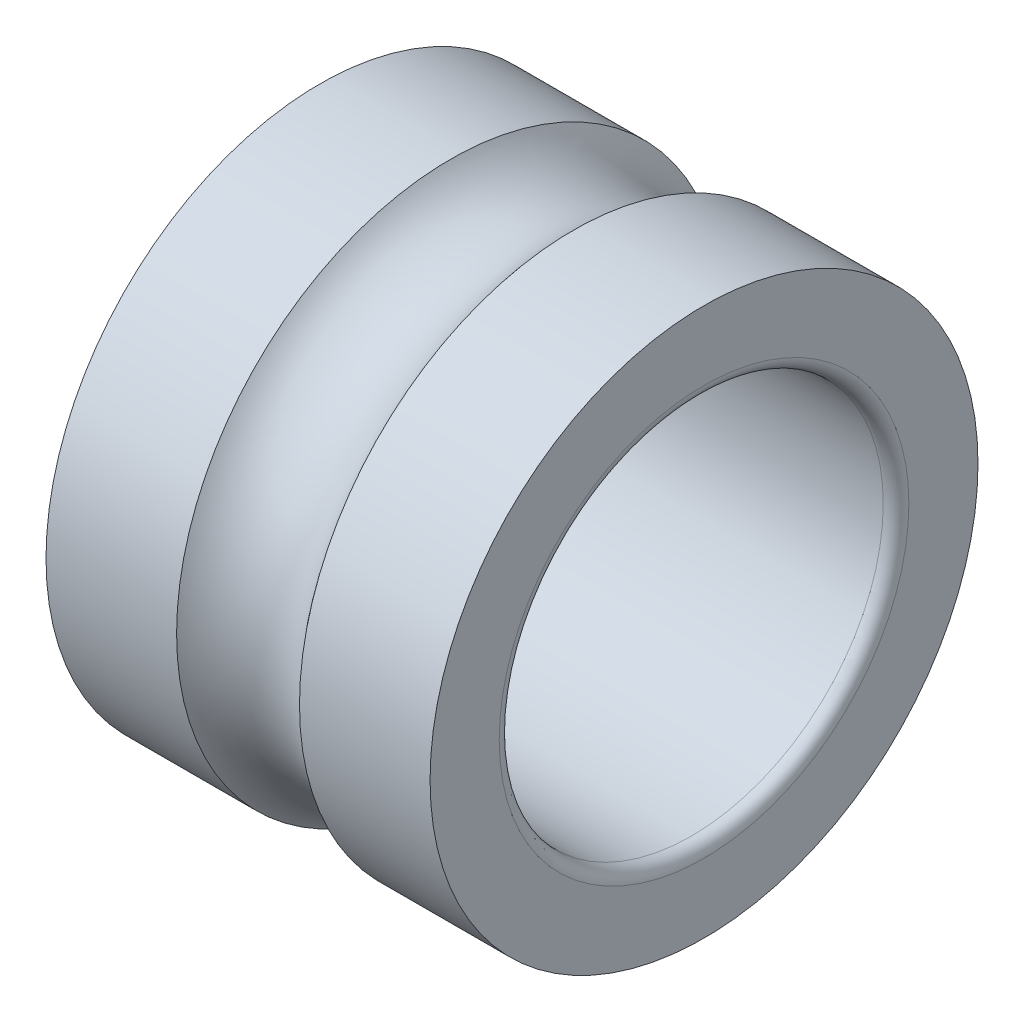
ISO-10303-21;
HEADER;
FILE_DESCRIPTION(('STEP AP214'),'2;1');
FILE_NAME('part.step','',(''),(''),'','','');
FILE_SCHEMA(('AUTOMOTIVE_DESIGN { 1 0 10303 214 1 1 1 1 }'));
ENDSEC;
DATA;
#1=APPLICATION_CONTEXT('core data for automotive mechanical design processes');
#2=APPLICATION_PROTOCOL_DEFINITION('international standard','automotive_design',2000,#1);
#3=PRODUCT_CONTEXT('',#1,'mechanical');
#4=PRODUCT('Part','Part','',(#3));
#5=PRODUCT_RELATED_PRODUCT_CATEGORY('part','',(#4));
#6=PRODUCT_DEFINITION_FORMATION('','',#4);
#7=PRODUCT_DEFINITION_CONTEXT('part definition',#1,'design');
#8=PRODUCT_DEFINITION('design','',#6,#7);
#9=PRODUCT_DEFINITION_SHAPE('','',#8);
#10=(LENGTH_UNIT() NAMED_UNIT(*) SI_UNIT(.MILLI.,.METRE.));
#11=(NAMED_UNIT(*) PLANE_ANGLE_UNIT() SI_UNIT($,.RADIAN.));
#12=(NAMED_UNIT(*) SI_UNIT($,.STERADIAN.) SOLID_ANGLE_UNIT());
#13=UNCERTAINTY_MEASURE_WITH_UNIT(LENGTH_MEASURE(1.E-05),#10,'distance_accuracy_value','');
#14=(GEOMETRIC_REPRESENTATION_CONTEXT(3) GLOBAL_UNCERTAINTY_ASSIGNED_CONTEXT((#13)) GLOBAL_UNIT_ASSIGNED_CONTEXT((#10,
#11,#12)) REPRESENTATION_CONTEXT('',''));
#15=CARTESIAN_POINT('',(0.,0.,0.));
#16=DIRECTION('',(0.,0.,1.));
#17=DIRECTION('',(1.,0.,0.));
#18=AXIS2_PLACEMENT_3D('',#15,#16,#17);
#19=CARTESIAN_POINT('',(-0.5,0.,0.));
#20=DIRECTION('',(1.,0.,0.));
#21=DIRECTION('',(0.,0.,-1.));
#22=AXIS2_PLACEMENT_3D('',#19,#20,#21);
#23=CYLINDRICAL_SURFACE('',#22,2.14);
#24=CARTESIAN_POINT('',(-0.5,0.,0.));
#25=DIRECTION('',(-1.,0.,0.));
#26=DIRECTION('',(0.,0.,1.));
#27=AXIS2_PLACEMENT_3D('',#24,#25,#26);
#28=CIRCLE('',#27,2.14);
#29=CARTESIAN_POINT('',(-0.5,0.,2.14));
#30=VERTEX_POINT('',#29);
#31=CARTESIAN_POINT('',(-0.5,0.,-2.14));
#32=VERTEX_POINT('',#31);
#33=EDGE_CURVE('E85',#30,#32,#28,.T.);
#34=ORIENTED_EDGE('',*,*,#33,.F.);
#35=CARTESIAN_POINT('',(-0.5,0.,0.));
#36=DIRECTION('',(-1.,0.,0.));
#37=DIRECTION('',(0.,0.,-1.));
#38=AXIS2_PLACEMENT_3D('',#35,#36,#37);
#39=CIRCLE('',#38,2.14);
#40=EDGE_CURVE('E75',#32,#30,#39,.T.);
#41=ORIENTED_EDGE('',*,*,#40,.F.);
#42=DIRECTION('',(1.,0.,0.));
#43=VECTOR('',#42,1.);
#44=CARTESIAN_POINT('',(0.00999999999999997,0.,-2.14));
#45=LINE('',#44,#43);
#46=CARTESIAN_POINT('',(0.52,0.,-2.14));
#47=VERTEX_POINT('',#46);
#48=EDGE_CURVE('E11',#32,#47,#45,.T.);
#49=ORIENTED_EDGE('',*,*,#48,.T.);
#50=CARTESIAN_POINT('',(0.52,0.,0.));
#51=DIRECTION('',(-1.,0.,0.));
#52=DIRECTION('',(0.,0.,-1.));
#53=AXIS2_PLACEMENT_3D('',#50,#51,#52);
#54=CIRCLE('',#53,2.14);
#55=CARTESIAN_POINT('',(0.52,0.,2.14));
#56=VERTEX_POINT('',#55);
#57=EDGE_CURVE('E27',#47,#56,#54,.T.);
#58=ORIENTED_EDGE('',*,*,#57,.T.);
#59=CARTESIAN_POINT('',(0.52,0.,0.));
#60=DIRECTION('',(-1.,0.,0.));
#61=DIRECTION('',(0.,0.,1.));
#62=AXIS2_PLACEMENT_3D('',#59,#60,#61);
#63=CIRCLE('',#62,2.14);
#64=EDGE_CURVE('E145',#56,#47,#63,.T.);
#65=ORIENTED_EDGE('',*,*,#64,.T.);
#66=ORIENTED_EDGE('',*,*,#48,.F.);
#67=EDGE_LOOP('',(#34,#41,#49,#58,#65,#66));
#68=FACE_BOUND('',#67,.T.);
#69=ADVANCED_FACE('F16',(#68),#23,.T.);
#70=CARTESIAN_POINT('',(0.999999999999995,0.,0.));
#71=DIRECTION('',(-1.,0.,0.));
#72=DIRECTION('',(0.,0.,1.));
#73=AXIS2_PLACEMENT_3D('',#70,#71,#72);
#74=TOROIDAL_SURFACE('',#73,2.49999999999999,0.599999999999992);
#75=CARTESIAN_POINT('',(1.48,0.,0.));
#76=DIRECTION('',(-1.,0.,0.));
#77=DIRECTION('',(0.,0.,1.));
#78=AXIS2_PLACEMENT_3D('',#75,#76,#77);
#79=CIRCLE('',#78,2.14);
#80=CARTESIAN_POINT('',(1.48,0.,2.14));
#81=VERTEX_POINT('',#80);
#82=CARTESIAN_POINT('',(1.48,0.,-2.14));
#83=VERTEX_POINT('',#82);
#84=EDGE_CURVE('E170',#81,#83,#79,.T.);
#85=ORIENTED_EDGE('',*,*,#84,.T.);
#86=CARTESIAN_POINT('',(0.999999999999999,0.,-2.5));
#87=DIRECTION('',(0.,-1.,0.));
#88=DIRECTION('',(0.8,0.,0.6));
#89=AXIS2_PLACEMENT_3D('',#86,#87,#88);
#90=CIRCLE('',#89,0.600000000000001);
#91=EDGE_CURVE('E151',#83,#47,#90,.T.);
#92=ORIENTED_EDGE('',*,*,#91,.T.);
#93=ORIENTED_EDGE('',*,*,#64,.F.);
#94=ORIENTED_EDGE('',*,*,#57,.F.);
#95=ORIENTED_EDGE('',*,*,#91,.F.);
#96=CARTESIAN_POINT('',(1.48,0.,0.));
#97=DIRECTION('',(-1.,0.,0.));
#98=DIRECTION('',(0.,0.,-1.));
#99=AXIS2_PLACEMENT_3D('',#96,#97,#98);
#100=CIRCLE('',#99,2.14);
#101=EDGE_CURVE('E167',#83,#81,#100,.T.);
#102=ORIENTED_EDGE('',*,*,#101,.T.);
#103=EDGE_LOOP('',(#85,#92,#93,#94,#95,#102));
#104=FACE_BOUND('',#103,.T.);
#105=ADVANCED_FACE('F149',(#104),#74,.F.);
#106=CARTESIAN_POINT('',(1.48,0.,0.));
#107=DIRECTION('',(1.,0.,0.));
#108=DIRECTION('',(0.,0.,-1.));
#109=AXIS2_PLACEMENT_3D('',#106,#107,#108);
#110=CYLINDRICAL_SURFACE('',#109,2.14);
#111=ORIENTED_EDGE('',*,*,#84,.F.);
#112=ORIENTED_EDGE('',*,*,#101,.F.);
#113=DIRECTION('',(1.,0.,0.));
#114=VECTOR('',#113,1.);
#115=CARTESIAN_POINT('',(1.99,0.,-2.14));
#116=LINE('',#115,#114);
#117=CARTESIAN_POINT('',(2.5,0.,-2.14));
#118=VERTEX_POINT('',#117);
#119=EDGE_CURVE('E163',#83,#118,#116,.T.);
#120=ORIENTED_EDGE('',*,*,#119,.T.);
#121=CARTESIAN_POINT('',(2.5,0.,0.));
#122=DIRECTION('',(-1.,0.,0.));
#123=DIRECTION('',(0.,0.,-1.));
#124=AXIS2_PLACEMENT_3D('',#121,#122,#123);
#125=CIRCLE('',#124,2.14);
#126=CARTESIAN_POINT('',(2.5,0.,2.14));
#127=VERTEX_POINT('',#126);
#128=EDGE_CURVE('E173',#118,#127,#125,.T.);
#129=ORIENTED_EDGE('',*,*,#128,.T.);
#130=CARTESIAN_POINT('',(2.5,0.,0.));
#131=DIRECTION('',(-1.,0.,0.));
#132=DIRECTION('',(0.,0.,1.));
#133=AXIS2_PLACEMENT_3D('',#130,#131,#132);
#134=CIRCLE('',#133,2.14);
#135=EDGE_CURVE('E70',#127,#118,#134,.T.);
#136=ORIENTED_EDGE('',*,*,#135,.T.);
#137=ORIENTED_EDGE('',*,*,#119,.F.);
#138=EDGE_LOOP('',(#111,#112,#120,#129,#136,#137));
#139=FACE_BOUND('',#138,.T.);
#140=ADVANCED_FACE('F184',(#139),#110,.T.);
#141=CARTESIAN_POINT('',(2.5,-2.15,2.15));
#142=DIRECTION('',(1.,0.,0.));
#143=DIRECTION('',(0.,0.,-1.));
#144=AXIS2_PLACEMENT_3D('',#141,#142,#143);
#145=PLANE('',#144);
#146=CARTESIAN_POINT('',(2.5,0.,0.));
#147=DIRECTION('',(1.,0.,0.));
#148=DIRECTION('',(0.,0.,1.));
#149=AXIS2_PLACEMENT_3D('',#146,#147,#148);
#150=CIRCLE('',#149,1.6);
#151=CARTESIAN_POINT('',(2.5,0.,1.6));
#152=VERTEX_POINT('',#151);
#153=CARTESIAN_POINT('',(2.5,0.,-1.6));
#154=VERTEX_POINT('',#153);
#155=EDGE_CURVE('E65',#152,#154,#150,.T.);
#156=ORIENTED_EDGE('',*,*,#155,.F.);
#157=CARTESIAN_POINT('',(2.5,0.,0.));
#158=DIRECTION('',(1.,0.,0.));
#159=DIRECTION('',(0.,0.,-1.));
#160=AXIS2_PLACEMENT_3D('',#157,#158,#159);
#161=CIRCLE('',#160,1.6);
#162=EDGE_CURVE('E61',#154,#152,#161,.T.);
#163=ORIENTED_EDGE('',*,*,#162,.F.);
#164=EDGE_LOOP('',(#156,#163));
#165=FACE_BOUND('',#164,.T.);
#166=ORIENTED_EDGE('',*,*,#135,.F.);
#167=ORIENTED_EDGE('',*,*,#128,.F.);
#168=EDGE_LOOP('',(#166,#167));
#169=FACE_BOUND('',#168,.T.);
#170=ADVANCED_FACE('F72',(#165,#169),#145,.T.);
#171=CARTESIAN_POINT('',(2.4,0.,0.));
#172=DIRECTION('',(-1.,0.,0.));
#173=DIRECTION('',(0.,0.,1.));
#174=AXIS2_PLACEMENT_3D('',#171,#172,#173);
#175=TOROIDAL_SURFACE('',#174,1.6,0.1);
#176=ORIENTED_EDGE('',*,*,#155,.T.);
#177=CARTESIAN_POINT('',(2.4,0.,-1.6));
#178=DIRECTION('',(0.,-1.,0.));
#179=DIRECTION('',(1.,0.,0.));
#180=AXIS2_PLACEMENT_3D('',#177,#178,#179);
#181=CIRCLE('',#180,0.1);
#182=CARTESIAN_POINT('',(2.4,0.,-1.5));
#183=VERTEX_POINT('',#182);
#184=EDGE_CURVE('E67',#154,#183,#181,.T.);
#185=ORIENTED_EDGE('',*,*,#184,.T.);
#186=CARTESIAN_POINT('',(2.4,0.,0.));
#187=DIRECTION('',(-1.,0.,0.));
#188=DIRECTION('',(0.,0.,-1.));
#189=AXIS2_PLACEMENT_3D('',#186,#187,#188);
#190=CIRCLE('',#189,1.5);
#191=CARTESIAN_POINT('',(2.4,0.,1.5));
#192=VERTEX_POINT('',#191);
#193=EDGE_CURVE('E91',#183,#192,#190,.T.);
#194=ORIENTED_EDGE('',*,*,#193,.T.);
#195=CARTESIAN_POINT('',(2.4,0.,0.));
#196=DIRECTION('',(-1.,0.,0.));
#197=DIRECTION('',(0.,0.,1.));
#198=AXIS2_PLACEMENT_3D('',#195,#196,#197);
#199=CIRCLE('',#198,1.5);
#200=EDGE_CURVE('E94',#192,#183,#199,.T.);
#201=ORIENTED_EDGE('',*,*,#200,.T.);
#202=ORIENTED_EDGE('',*,*,#184,.F.);
#203=ORIENTED_EDGE('',*,*,#162,.T.);
#204=EDGE_LOOP('',(#176,#185,#194,#201,#202,#203));
#205=FACE_BOUND('',#204,.T.);
#206=ADVANCED_FACE('F63',(#205),#175,.T.);
#207=CARTESIAN_POINT('',(-0.5,-2.15,-2.15));
#208=DIRECTION('',(-1.,0.,0.));
#209=DIRECTION('',(0.,0.,1.));
#210=AXIS2_PLACEMENT_3D('',#207,#208,#209);
#211=PLANE('',#210);
#212=CARTESIAN_POINT('',(-0.5,0.,0.));
#213=DIRECTION('',(-1.,0.,0.));
#214=DIRECTION('',(0.,0.,1.));
#215=AXIS2_PLACEMENT_3D('',#212,#213,#214);
#216=CIRCLE('',#215,1.6);
#217=CARTESIAN_POINT('',(-0.5,0.,1.6));
#218=VERTEX_POINT('',#217);
#219=CARTESIAN_POINT('',(-0.5,0.,-1.6));
#220=VERTEX_POINT('',#219);
#221=EDGE_CURVE('E105',#218,#220,#216,.T.);
#222=ORIENTED_EDGE('',*,*,#221,.F.);
#223=CARTESIAN_POINT('',(-0.5,0.,0.));
#224=DIRECTION('',(-1.,0.,0.));
#225=DIRECTION('',(0.,0.,-1.));
#226=AXIS2_PLACEMENT_3D('',#223,#224,#225);
#227=CIRCLE('',#226,1.6);
#228=EDGE_CURVE('E109',#220,#218,#227,.T.);
#229=ORIENTED_EDGE('',*,*,#228,.F.);
#230=EDGE_LOOP('',(#222,#229));
#231=FACE_BOUND('',#230,.T.);
#232=ORIENTED_EDGE('',*,*,#33,.T.);
#233=ORIENTED_EDGE('',*,*,#40,.T.);
#234=EDGE_LOOP('',(#232,#233));
#235=FACE_BOUND('',#234,.T.);
#236=ADVANCED_FACE('F139',(#231,#235),#211,.T.);
#237=CARTESIAN_POINT('',(2.4,0.,0.));
#238=DIRECTION('',(-1.,0.,0.));
#239=DIRECTION('',(0.,0.,1.));
#240=AXIS2_PLACEMENT_3D('',#237,#238,#239);
#241=CYLINDRICAL_SURFACE('',#240,1.5);
#242=CARTESIAN_POINT('',(-0.4,0.,0.));
#243=DIRECTION('',(1.,0.,0.));
#244=DIRECTION('',(0.,0.,1.));
#245=AXIS2_PLACEMENT_3D('',#242,#243,#244);
#246=CIRCLE('',#245,1.5);
#247=CARTESIAN_POINT('',(-0.4,0.,1.5));
#248=VERTEX_POINT('',#247);
#249=CARTESIAN_POINT('',(-0.4,0.,-1.5));
#250=VERTEX_POINT('',#249);
#251=EDGE_CURVE('E20',#248,#250,#246,.T.);
#252=ORIENTED_EDGE('',*,*,#251,.F.);
#253=CARTESIAN_POINT('',(-0.4,0.,0.));
#254=DIRECTION('',(1.,0.,0.));
#255=DIRECTION('',(0.,0.,-1.));
#256=AXIS2_PLACEMENT_3D('',#253,#254,#255);
#257=CIRCLE('',#256,1.5);
#258=EDGE_CURVE('E101',#250,#248,#257,.T.);
#259=ORIENTED_EDGE('',*,*,#258,.F.);
#260=DIRECTION('',(1.,0.,0.));
#261=VECTOR('',#260,1.);
#262=CARTESIAN_POINT('',(1.,0.,-1.5));
#263=LINE('',#262,#261);
#264=EDGE_CURVE('E97',#250,#183,#263,.T.);
#265=ORIENTED_EDGE('',*,*,#264,.T.);
#266=ORIENTED_EDGE('',*,*,#200,.F.);
#267=ORIENTED_EDGE('',*,*,#193,.F.);
#268=ORIENTED_EDGE('',*,*,#264,.F.);
#269=EDGE_LOOP('',(#252,#259,#265,#266,#267,#268));
#270=FACE_BOUND('',#269,.T.);
#271=ADVANCED_FACE('F129',(#270),#241,.F.);
#272=CARTESIAN_POINT('',(-0.400000000000001,0.,0.));
#273=DIRECTION('',(-1.,0.,0.));
#274=DIRECTION('',(0.,0.,1.));
#275=AXIS2_PLACEMENT_3D('',#272,#273,#274);
#276=TOROIDAL_SURFACE('',#275,1.6,0.0999999999999995);
#277=ORIENTED_EDGE('',*,*,#251,.T.);
#278=CARTESIAN_POINT('',(-0.400000000000001,0.,-1.6));
#279=DIRECTION('',(0.,-1.,0.));
#280=DIRECTION('',(0.,0.,1.));
#281=AXIS2_PLACEMENT_3D('',#278,#279,#280);
#282=CIRCLE('',#281,0.0999999999999995);
#283=EDGE_CURVE('E111',#250,#220,#282,.T.);
#284=ORIENTED_EDGE('',*,*,#283,.T.);
#285=ORIENTED_EDGE('',*,*,#228,.T.);
#286=ORIENTED_EDGE('',*,*,#221,.T.);
#287=ORIENTED_EDGE('',*,*,#283,.F.);
#288=ORIENTED_EDGE('',*,*,#258,.T.);
#289=EDGE_LOOP('',(#277,#284,#285,#286,#287,#288));
#290=FACE_BOUND('',#289,.T.);
#291=ADVANCED_FACE('F18',(#290),#276,.T.);
#292=CLOSED_SHELL('',(#69,#105,#140,#170,#206,#236,#271,#291));
#293=MANIFOLD_SOLID_BREP('B1',#292);
#294=ADVANCED_BREP_SHAPE_REPRESENTATION('',(#18,#293),#14);
#295=SHAPE_DEFINITION_REPRESENTATION(#9,#294);
ENDSEC;
END-ISO-10303-21;
